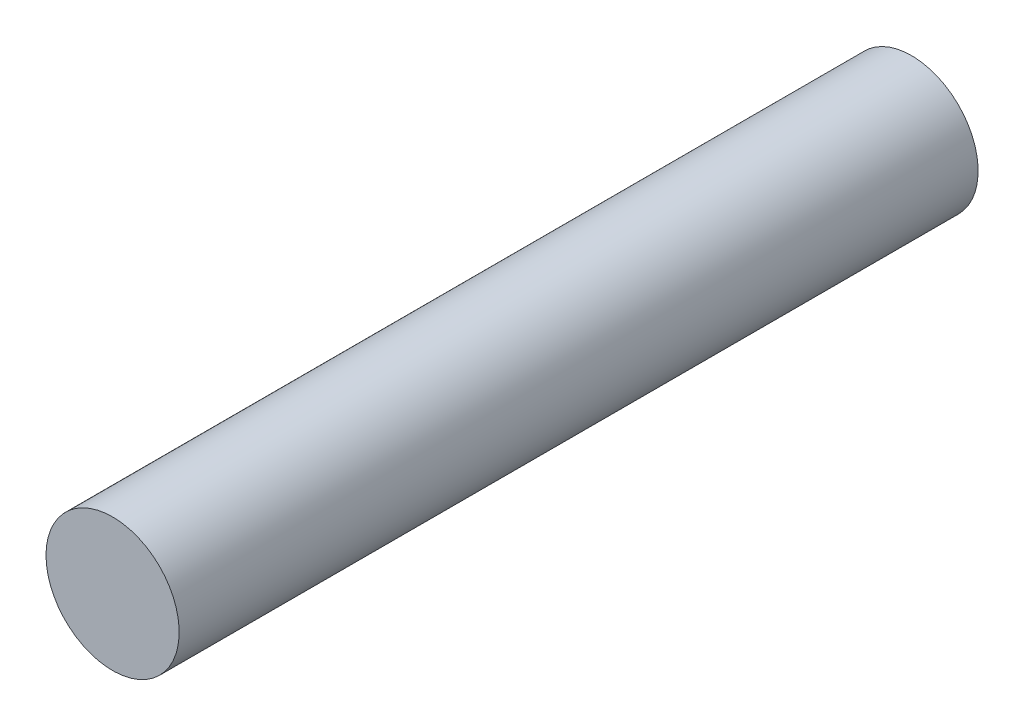
ISO-10303-21;
HEADER;
FILE_DESCRIPTION(('STEP AP214'),'2;1');
FILE_NAME('part.step','',(''),(''),'','','');
FILE_SCHEMA(('AUTOMOTIVE_DESIGN { 1 0 10303 214 1 1 1 1 }'));
ENDSEC;
DATA;
#1=APPLICATION_CONTEXT('core data for automotive mechanical design processes');
#2=APPLICATION_PROTOCOL_DEFINITION('international standard','automotive_design',2000,#1);
#3=PRODUCT_CONTEXT('',#1,'mechanical');
#4=PRODUCT('Part','Part','',(#3));
#5=PRODUCT_RELATED_PRODUCT_CATEGORY('part','',(#4));
#6=PRODUCT_DEFINITION_FORMATION('','',#4);
#7=PRODUCT_DEFINITION_CONTEXT('part definition',#1,'design');
#8=PRODUCT_DEFINITION('design','',#6,#7);
#9=PRODUCT_DEFINITION_SHAPE('','',#8);
#10=(LENGTH_UNIT() NAMED_UNIT(*) SI_UNIT(.MILLI.,.METRE.));
#11=(NAMED_UNIT(*) PLANE_ANGLE_UNIT() SI_UNIT($,.RADIAN.));
#12=(NAMED_UNIT(*) SI_UNIT($,.STERADIAN.) SOLID_ANGLE_UNIT());
#13=UNCERTAINTY_MEASURE_WITH_UNIT(LENGTH_MEASURE(1.E-05),#10,'distance_accuracy_value','');
#14=(GEOMETRIC_REPRESENTATION_CONTEXT(3) GLOBAL_UNCERTAINTY_ASSIGNED_CONTEXT((#13)) GLOBAL_UNIT_ASSIGNED_CONTEXT((#10,
#11,#12)) REPRESENTATION_CONTEXT('',''));
#15=CARTESIAN_POINT('',(0.,0.,0.));
#16=DIRECTION('',(0.,0.,1.));
#17=DIRECTION('',(1.,0.,0.));
#18=AXIS2_PLACEMENT_3D('',#15,#16,#17);
#19=CARTESIAN_POINT('',(0.,0.,76.2));
#20=DIRECTION('',(0.,0.,-1.));
#21=DIRECTION('',(-1.,0.,0.));
#22=AXIS2_PLACEMENT_3D('',#19,#20,#21);
#23=CYLINDRICAL_SURFACE('',#22,6.35);
#24=CARTESIAN_POINT('',(0.,0.,76.2));
#25=DIRECTION('',(0.,0.,1.));
#26=DIRECTION('',(1.,0.,0.));
#27=AXIS2_PLACEMENT_3D('',#24,#25,#26);
#28=CIRCLE('',#27,6.35);
#29=CARTESIAN_POINT('',(-6.35,0.,76.2));
#30=VERTEX_POINT('',#29);
#31=EDGE_CURVE('E10',#30,#30,#28,.T.);
#32=CARTESIAN_POINT('',(0.,0.,0.));
#33=DIRECTION('',(0.,0.,1.));
#34=DIRECTION('',(1.,0.,0.));
#35=AXIS2_PLACEMENT_3D('',#32,#33,#34);
#36=CIRCLE('',#35,6.35);
#37=CARTESIAN_POINT('',(-6.35,0.,0.));
#38=VERTEX_POINT('',#37);
#39=EDGE_CURVE('E39',#38,#38,#36,.T.);
#40=CARTESIAN_POINT('',(-6.35,0.,76.2));
#41=CARTESIAN_POINT('',(-6.35,0.,75.40625));
#42=CARTESIAN_POINT('',(-6.35,0.,74.6125));
#43=CARTESIAN_POINT('',(-6.35,0.,73.025));
#44=CARTESIAN_POINT('',(-6.35,0.,72.23125));
#45=CARTESIAN_POINT('',(-6.35,0.,70.64375));
#46=CARTESIAN_POINT('',(-6.35,0.,69.85));
#47=CARTESIAN_POINT('',(-6.35,0.,68.2625));
#48=CARTESIAN_POINT('',(-6.35,0.,67.46875));
#49=CARTESIAN_POINT('',(-6.35,0.,65.88125));
#50=CARTESIAN_POINT('',(-6.35,0.,65.0875));
#51=CARTESIAN_POINT('',(-6.35,0.,63.5));
#52=CARTESIAN_POINT('',(-6.35,0.,62.70625));
#53=CARTESIAN_POINT('',(-6.35,0.,61.11875));
#54=CARTESIAN_POINT('',(-6.35,0.,60.325));
#55=CARTESIAN_POINT('',(-6.35,0.,58.7375));
#56=CARTESIAN_POINT('',(-6.35,0.,57.94375));
#57=CARTESIAN_POINT('',(-6.35,0.,56.35625));
#58=CARTESIAN_POINT('',(-6.35,0.,55.5625));
#59=CARTESIAN_POINT('',(-6.35,0.,53.975));
#60=CARTESIAN_POINT('',(-6.35,0.,53.18125));
#61=CARTESIAN_POINT('',(-6.35,0.,51.59375));
#62=CARTESIAN_POINT('',(-6.35,0.,50.8));
#63=CARTESIAN_POINT('',(-6.35,0.,49.2125));
#64=CARTESIAN_POINT('',(-6.35,0.,48.41875));
#65=CARTESIAN_POINT('',(-6.35,0.,46.83125));
#66=CARTESIAN_POINT('',(-6.35,0.,46.0375));
#67=CARTESIAN_POINT('',(-6.35,0.,44.45));
#68=CARTESIAN_POINT('',(-6.35,0.,43.65625));
#69=CARTESIAN_POINT('',(-6.35,0.,42.06875));
#70=CARTESIAN_POINT('',(-6.35,0.,41.275));
#71=CARTESIAN_POINT('',(-6.35,0.,39.6875));
#72=CARTESIAN_POINT('',(-6.35,0.,38.89375));
#73=CARTESIAN_POINT('',(-6.35,0.,37.30625));
#74=CARTESIAN_POINT('',(-6.35,0.,36.5125));
#75=CARTESIAN_POINT('',(-6.35,0.,34.925));
#76=CARTESIAN_POINT('',(-6.35,0.,34.13125));
#77=CARTESIAN_POINT('',(-6.35,0.,32.54375));
#78=CARTESIAN_POINT('',(-6.35,0.,31.75));
#79=CARTESIAN_POINT('',(-6.35,0.,30.1625));
#80=CARTESIAN_POINT('',(-6.35,0.,29.36875));
#81=CARTESIAN_POINT('',(-6.35,0.,27.78125));
#82=CARTESIAN_POINT('',(-6.35,0.,26.9875));
#83=CARTESIAN_POINT('',(-6.35,0.,25.4));
#84=CARTESIAN_POINT('',(-6.35,0.,24.60625));
#85=CARTESIAN_POINT('',(-6.35,0.,23.01875));
#86=CARTESIAN_POINT('',(-6.35,0.,22.225));
#87=CARTESIAN_POINT('',(-6.35,0.,20.6375));
#88=CARTESIAN_POINT('',(-6.35,0.,19.84375));
#89=CARTESIAN_POINT('',(-6.35,0.,18.25625));
#90=CARTESIAN_POINT('',(-6.35,0.,17.4625));
#91=CARTESIAN_POINT('',(-6.35,0.,15.875));
#92=CARTESIAN_POINT('',(-6.35,0.,15.08125));
#93=CARTESIAN_POINT('',(-6.35,0.,13.49375));
#94=CARTESIAN_POINT('',(-6.35,0.,12.7));
#95=CARTESIAN_POINT('',(-6.35,0.,11.1125));
#96=CARTESIAN_POINT('',(-6.35,0.,10.31875));
#97=CARTESIAN_POINT('',(-6.35,0.,8.73125));
#98=CARTESIAN_POINT('',(-6.35,0.,7.93750000000001));
#99=CARTESIAN_POINT('',(-6.35,0.,6.35));
#100=CARTESIAN_POINT('',(-6.35,0.,5.55625));
#101=CARTESIAN_POINT('',(-6.35,0.,3.96875));
#102=CARTESIAN_POINT('',(-6.35,0.,3.175));
#103=CARTESIAN_POINT('',(-6.35,0.,1.5875));
#104=CARTESIAN_POINT('',(-6.35,0.,0.793750000000001));
#105=CARTESIAN_POINT('',(-6.35,0.,0.));
#106=B_SPLINE_CURVE_WITH_KNOTS('',3,(#40,#41,#42,#43,#44,#45,#46,#47,#48,#49,#50,#51,#52,#53,
#54,#55,#56,#57,#58,#59,#60,#61,#62,#63,#64,#65,#66,#67,#68,#69,#70,#71,#72,#73,#74,#75,#76,#77,
#78,#79,#80,#81,#82,#83,#84,#85,#86,#87,#88,#89,#90,#91,#92,#93,#94,#95,#96,#97,#98,#99,#100,
#101,#102,#103,#104,#105),.UNSPECIFIED.,.F.,.F.,(4,2,2,2,2,2,2,2,2,2,2,2,2,2,2,2,2,2,2,2,2,2,2,
2,2,2,2,2,2,2,2,2,4),(0.,2.38124999999999,4.76249999999999,7.14374999999999,9.52499999999999,
11.90625,14.2875,16.66875,19.05,21.43125,23.8125,26.19375,28.575,30.95625,33.3375,35.71875,38.1,
40.48125,42.8625,45.24375,47.625,50.00625,52.3875,54.76875,57.15,59.53125,61.9125,64.29375,
66.675,69.05625,71.4375,73.81875,76.2),.UNSPECIFIED.);
#107=EDGE_CURVE('BSEAM36',#30,#38,#106,.T.);
#108=ORIENTED_EDGE('',*,*,#31,.F.);
#109=ORIENTED_EDGE('',*,*,#39,.T.);
#110=ORIENTED_EDGE('',*,*,#107,.T.);
#111=ORIENTED_EDGE('',*,*,#107,.F.);
#112=EDGE_LOOP('',(#108,#110,#109,#111));
#113=FACE_BOUND('',#112,.T.);
#114=ADVANCED_FACE('F36',(#113),#23,.T.);
#115=CARTESIAN_POINT('',(0.,0.,76.2));
#116=DIRECTION('',(0.,0.,1.));
#117=DIRECTION('',(1.,0.,0.));
#118=AXIS2_PLACEMENT_3D('',#115,#116,#117);
#119=PLANE('',#118);
#120=ORIENTED_EDGE('',*,*,#31,.T.);
#121=EDGE_LOOP('',(#120));
#122=FACE_BOUND('',#121,.T.);
#123=ADVANCED_FACE('F51',(#122),#119,.T.);
#124=CARTESIAN_POINT('',(0.,0.,0.));
#125=DIRECTION('',(0.,0.,1.));
#126=DIRECTION('',(1.,0.,0.));
#127=AXIS2_PLACEMENT_3D('',#124,#125,#126);
#128=PLANE('',#127);
#129=ORIENTED_EDGE('',*,*,#39,.F.);
#130=EDGE_LOOP('',(#129));
#131=FACE_BOUND('',#130,.T.);
#132=ADVANCED_FACE('F49',(#131),#128,.F.);
#133=CLOSED_SHELL('',(#114,#123,#132));
#134=MANIFOLD_SOLID_BREP('B2',#133);
#135=ADVANCED_BREP_SHAPE_REPRESENTATION('',(#18,#134),#14);
#136=SHAPE_DEFINITION_REPRESENTATION(#9,#135);
ENDSEC;
END-ISO-10303-21;
